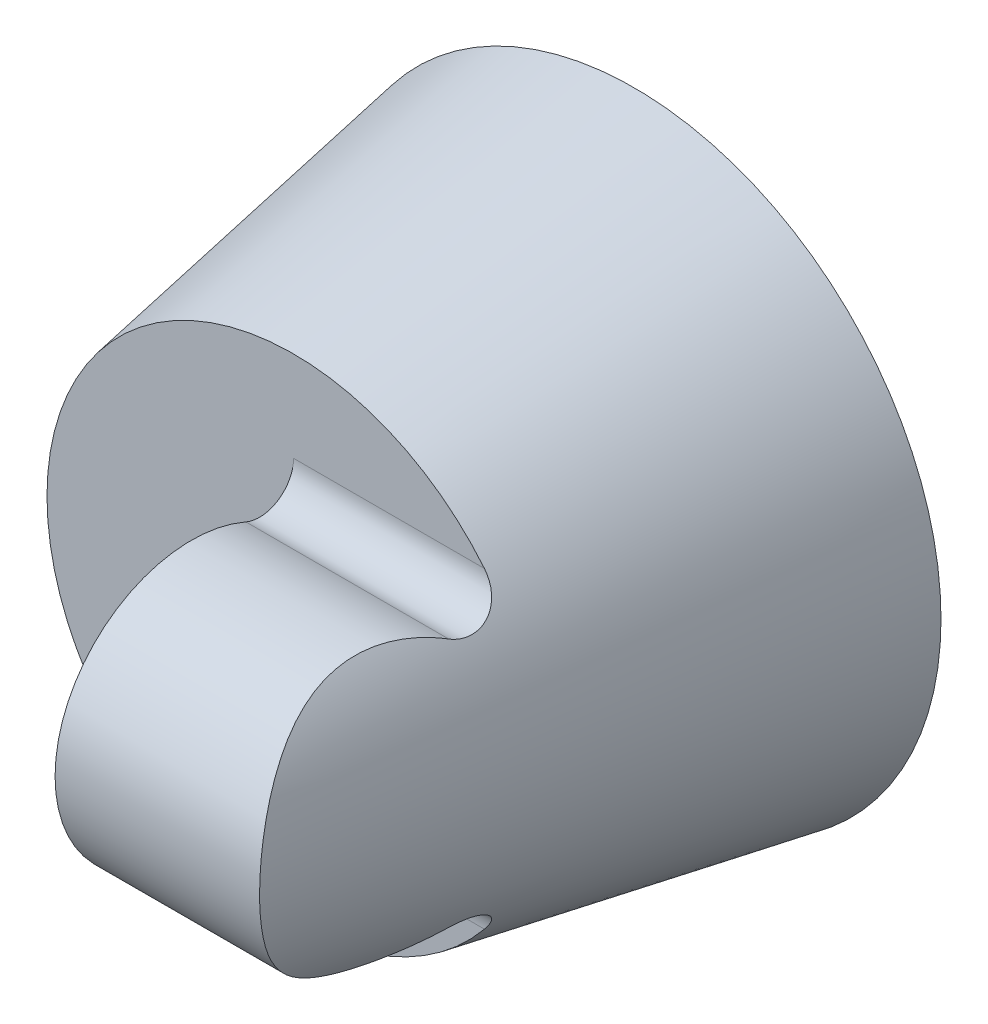
ISO-10303-21;
HEADER;
FILE_DESCRIPTION(('STEP AP214'),'2;1');
FILE_NAME('part.step','',(''),(''),'','','');
FILE_SCHEMA(('AUTOMOTIVE_DESIGN { 1 0 10303 214 1 1 1 1 }'));
ENDSEC;
DATA;
#1=APPLICATION_CONTEXT('core data for automotive mechanical design processes');
#2=APPLICATION_PROTOCOL_DEFINITION('international standard','automotive_design',2000,#1);
#3=PRODUCT_CONTEXT('',#1,'mechanical');
#4=PRODUCT('Part','Part','',(#3));
#5=PRODUCT_RELATED_PRODUCT_CATEGORY('part','',(#4));
#6=PRODUCT_DEFINITION_FORMATION('','',#4);
#7=PRODUCT_DEFINITION_CONTEXT('part definition',#1,'design');
#8=PRODUCT_DEFINITION('design','',#6,#7);
#9=PRODUCT_DEFINITION_SHAPE('','',#8);
#10=(LENGTH_UNIT() NAMED_UNIT(*) SI_UNIT(.MILLI.,.METRE.));
#11=(NAMED_UNIT(*) PLANE_ANGLE_UNIT() SI_UNIT($,.RADIAN.));
#12=(NAMED_UNIT(*) SI_UNIT($,.STERADIAN.) SOLID_ANGLE_UNIT());
#13=UNCERTAINTY_MEASURE_WITH_UNIT(LENGTH_MEASURE(1.E-05),#10,'distance_accuracy_value','');
#14=(GEOMETRIC_REPRESENTATION_CONTEXT(3) GLOBAL_UNCERTAINTY_ASSIGNED_CONTEXT((#13)) GLOBAL_UNIT_ASSIGNED_CONTEXT((#10,
#11,#12)) REPRESENTATION_CONTEXT('',''));
#15=CARTESIAN_POINT('',(0.,0.,0.));
#16=DIRECTION('',(0.,0.,1.));
#17=DIRECTION('',(1.,0.,0.));
#18=AXIS2_PLACEMENT_3D('',#15,#16,#17);
#19=CARTESIAN_POINT('',(0.,0.,50.));
#20=DIRECTION('',(0.,0.,1.));
#21=DIRECTION('',(1.,0.,0.));
#22=AXIS2_PLACEMENT_3D('',#19,#20,#21);
#23=PLANE('',#22);
#24=CARTESIAN_POINT('',(0.,0.,50.));
#25=DIRECTION('',(0.,0.,1.));
#26=DIRECTION('',(1.,0.,0.));
#27=AXIS2_PLACEMENT_3D('',#24,#25,#26);
#28=CIRCLE('',#27,36.1836509645767);
#29=CARTESIAN_POINT('',(28.0045817166819,22.9128784747792,50.));
#30=VERTEX_POINT('',#29);
#31=CARTESIAN_POINT('',(28.0045817166819,-22.9128784747792,50.));
#32=VERTEX_POINT('',#31);
#33=EDGE_CURVE('E89',#30,#32,#28,.T.);
#34=ORIENTED_EDGE('',*,*,#33,.T.);
#35=DIRECTION('',(-1.,0.,0.));
#36=VECTOR('',#35,1.);
#37=CARTESIAN_POINT('',(0.,-22.9128784747792,50.));
#38=LINE('',#37,#36);
#39=CARTESIAN_POINT('',(0.,-22.9128784747792,50.));
#40=VERTEX_POINT('',#39);
#41=EDGE_CURVE('E92',#32,#40,#38,.T.);
#42=ORIENTED_EDGE('',*,*,#41,.T.);
#43=DIRECTION('',(0.,1.,0.));
#44=VECTOR('',#43,1.);
#45=CARTESIAN_POINT('',(0.,0.,50.));
#46=LINE('',#45,#44);
#47=CARTESIAN_POINT('',(0.,22.9128784747792,50.));
#48=VERTEX_POINT('',#47);
#49=EDGE_CURVE('E91',#40,#48,#46,.T.);
#50=ORIENTED_EDGE('',*,*,#49,.T.);
#51=DIRECTION('',(-1.,0.,0.));
#52=VECTOR('',#51,1.);
#53=CARTESIAN_POINT('',(0.,22.9128784747792,50.));
#54=LINE('',#53,#52);
#55=EDGE_CURVE('E83',#48,#30,#54,.F.);
#56=ORIENTED_EDGE('',*,*,#55,.T.);
#57=EDGE_LOOP('',(#34,#42,#50,#56));
#58=FACE_BOUND('',#57,.T.);
#59=ADVANCED_FACE('F39',(#58),#23,.T.);
#60=CARTESIAN_POINT('',(0.,0.,0.));
#61=DIRECTION('',(0.,0.,-1.));
#62=DIRECTION('',(1.,0.,0.));
#63=AXIS2_PLACEMENT_3D('',#60,#61,#62);
#64=CONICAL_SURFACE('',#63,45.,0.174532925199433);
#65=CARTESIAN_POINT('',(26.735650953985,-16.9932657035637,75.5465122542046));
#66=CARTESIAN_POINT('',(26.8256812033181,-16.6921232034422,76.031728075175));
#67=CARTESIAN_POINT('',(26.9262545679072,-16.3709799959119,76.5027608983805));
#68=CARTESIAN_POINT('',(27.1424616532396,-15.6914401739554,77.4137859536683));
#69=CARTESIAN_POINT('',(27.2581064429691,-15.3330162186833,77.8537550016268));
#70=CARTESIAN_POINT('',(27.4989421870758,-14.5803219232676,78.7017002614123));
#71=CARTESIAN_POINT('',(27.6241627450931,-14.1859396300111,79.1095686410796));
#72=CARTESIAN_POINT('',(27.8782192429912,-13.3647178720242,79.8897636134298));
#73=CARTESIAN_POINT('',(28.0070544846206,-12.9378846489981,80.2620970100964));
#74=CARTESIAN_POINT('',(28.2629350994335,-12.0547739496392,80.9687694120351));
#75=CARTESIAN_POINT('',(28.3899834750714,-11.5985555635531,81.3031811503832));
#76=CARTESIAN_POINT('',(28.6377889535744,-10.6582105954403,81.9328890165752));
#77=CARTESIAN_POINT('',(28.7585458224187,-10.1740829767021,82.2281836900383));
#78=CARTESIAN_POINT('',(28.9892495791107,-9.18110328925213,82.7771982555706));
#79=CARTESIAN_POINT('',(29.0992093387543,-8.67228176843281,83.0309678984861));
#80=CARTESIAN_POINT('',(29.3045384356064,-7.63238173373401,83.4951590257565));
#81=CARTESIAN_POINT('',(29.3999083571291,-7.10130411228362,83.7055822462263));
#82=CARTESIAN_POINT('',(29.5717038703581,-6.02607902246342,84.0789628551392));
#83=CARTESIAN_POINT('',(29.6483172405865,-5.48212644979778,84.2423938542228));
#84=CARTESIAN_POINT('',(29.7811049698399,-4.37989610726095,84.5228033087537));
#85=CARTESIAN_POINT('',(29.8372793233915,-3.82161833355379,84.6397817517619));
#86=CARTESIAN_POINT('',(29.9270879522398,-2.69554846405606,84.8257289758765));
#87=CARTESIAN_POINT('',(29.9607313619724,-2.12776031974745,84.8947172134855));
#88=CARTESIAN_POINT('',(30.0042393357039,-0.987473899973739,84.9837897265954));
#89=CARTESIAN_POINT('',(30.0141060574429,-0.414976056646683,85.0038784397413));
#90=CARTESIAN_POINT('',(30.0099142003844,0.674163067082594,84.9953198208519));
#91=CARTESIAN_POINT('',(29.9980757627778,1.19085523343057,84.9711950280525));
#92=CARTESIAN_POINT('',(29.9550801122633,2.21998990773099,84.8831163501241));
#93=CARTESIAN_POINT('',(29.9239243186543,2.73243272509189,84.8191653911307));
#94=CARTESIAN_POINT('',(29.8432533607499,3.74940153504682,84.6521637561815));
#95=CARTESIAN_POINT('',(29.7937387233523,4.25392775441365,84.5491142023512));
#96=CARTESIAN_POINT('',(29.677847599141,5.2517128983917,84.3050077898015));
#97=CARTESIAN_POINT('',(29.6114706398569,5.74497150687023,84.1639498661075));
#98=CARTESIAN_POINT('',(29.4642033708386,6.71468016067764,83.8460104991172));
#99=CARTESIAN_POINT('',(29.3833894258811,7.19120357998317,83.6693169460731));
#100=CARTESIAN_POINT('',(29.2093477945447,8.12748859567426,83.2811589646249));
#101=CARTESIAN_POINT('',(29.1161202813734,8.58725042582167,83.0696950213651));
#102=CARTESIAN_POINT('',(28.9198633893562,9.4879400932493,82.6134590957196));
#103=CARTESIAN_POINT('',(28.8168306928591,9.92886148209318,82.36867582737));
#104=CARTESIAN_POINT('',(28.6039126545829,10.7897895929157,81.8473656975846));
#105=CARTESIAN_POINT('',(28.4940268879621,11.2097950153449,81.5708368672548));
#106=CARTESIAN_POINT('',(28.2600837611825,12.0655463258518,80.9600823002558));
#107=CARTESIAN_POINT('',(28.1356641933591,12.4990706898876,80.6228773778105));
#108=CARTESIAN_POINT('',(27.8869048794909,13.3369635805642,79.9139746732124));
#109=CARTESIAN_POINT('',(27.7625651388311,13.741330310861,79.5422747691129));
#110=CARTESIAN_POINT('',(27.5186737804238,14.5192615668158,78.7656560414995));
#111=CARTESIAN_POINT('',(27.3991264779333,14.8927986392791,78.3607082379315));
#112=CARTESIAN_POINT('',(27.2274242011127,15.4279380462901,77.730073235214));
#113=CARTESIAN_POINT('',(27.1714584460376,15.6021279506089,77.5159864435346));
#114=CARTESIAN_POINT('',(27.0627125433727,15.9419328312074,77.0801967848897));
#115=CARTESIAN_POINT('',(27.0099335960385,16.1075445733742,76.8584910971238));
#116=CARTESIAN_POINT('',(26.85324291648,16.6042687867543,76.1638262970617));
#117=CARTESIAN_POINT('',(26.7558075433071,16.9205293308785,75.6786122588916));
#118=CARTESIAN_POINT('',(26.5841765267063,17.5112671232136,74.6794670472275));
#119=CARTESIAN_POINT('',(26.5099762729382,17.7857526549098,74.1655415945653));
#120=CARTESIAN_POINT('',(26.4206707627051,18.1635824585249,73.3767059637336));
#121=CARTESIAN_POINT('',(26.394580050458,18.2837941643559,73.1109870106573));
#122=CARTESIAN_POINT('',(26.3503482977095,18.5126771393378,72.5740281191589));
#123=CARTESIAN_POINT('',(26.3322051907174,18.6213514028135,72.3027896351109));
#124=CARTESIAN_POINT('',(26.3044655645209,18.8268248708357,71.755449720507));
#125=CARTESIAN_POINT('',(26.2948680993244,18.9236253887683,71.4793488316649));
#126=CARTESIAN_POINT('',(26.2847036398224,19.1050620029728,70.9230273625542));
#127=CARTESIAN_POINT('',(26.2841368230814,19.1896978600256,70.6428067013893));
#128=CARTESIAN_POINT('',(26.2953343775881,19.4014796923482,69.8815837206693));
#129=CARTESIAN_POINT('',(26.3160095236272,19.516904215495,69.3973599216369));
#130=CARTESIAN_POINT('',(26.3855308282464,19.7110286445504,68.4237195119679));
#131=CARTESIAN_POINT('',(26.4343740708682,19.7897323502691,67.9343034439814));
#132=CARTESIAN_POINT('',(26.559870495643,19.9104050021821,66.9543665402008));
#133=CARTESIAN_POINT('',(26.6365322716807,19.9523625828338,66.463845409611));
#134=CARTESIAN_POINT('',(26.8161399775581,20.0000902592028,65.4859012174067));
#135=CARTESIAN_POINT('',(26.919086306098,20.0058598059638,64.9984782029014));
#136=CARTESIAN_POINT('',(27.1394210581701,19.983308136662,64.0698543238651));
#137=CARTESIAN_POINT('',(27.2549385293707,19.9577377345591,63.6281347560599));
#138=CARTESIAN_POINT('',(27.5038296731332,19.8781518941319,62.7522109056259));
#139=CARTESIAN_POINT('',(27.6372100689934,19.824125722979,62.318009522543));
#140=CARTESIAN_POINT('',(27.9192843360121,19.6888447137225,61.4590356114284));
#141=CARTESIAN_POINT('',(28.0679761095279,19.6075936019783,61.0342618014955));
#142=CARTESIAN_POINT('',(28.3781807041134,19.4190537289664,60.195287918349));
#143=CARTESIAN_POINT('',(28.5396953208874,19.3117613165454,59.7810893368564));
#144=CARTESIAN_POINT('',(28.9018416354351,19.0515874656243,58.8937677071447));
#145=CARTESIAN_POINT('',(29.1044150841776,18.8940346039053,58.4228045588158));
#146=CARTESIAN_POINT('',(29.5200434210934,18.5462323641008,57.4979053535212));
#147=CARTESIAN_POINT('',(29.7330991719549,18.3559802916632,57.043970703429));
#148=CARTESIAN_POINT('',(30.1664135898791,17.943872192745,56.153627390491));
#149=CARTESIAN_POINT('',(30.386679057757,17.7219856229551,55.7172361941403));
#150=CARTESIAN_POINT('',(30.8309665621533,17.2477842279824,54.8633097307249));
#151=CARTESIAN_POINT('',(31.0549888327587,16.9954675005816,54.4457756446807));
#152=CARTESIAN_POINT('',(31.5516530292367,16.4041632185311,53.5434204735242));
#153=CARTESIAN_POINT('',(31.8244663265407,16.0581714807377,53.0632598239276));
#154=CARTESIAN_POINT('',(32.3659318214802,15.3237105126026,52.1339685046008));
#155=CARTESIAN_POINT('',(32.6345832681755,14.9352337161103,51.6848433852952));
#156=CARTESIAN_POINT('',(33.1625641610206,14.1169067131309,50.8201909548061));
#157=CARTESIAN_POINT('',(33.4218970152423,13.6870718483982,50.4046512895609));
#158=CARTESIAN_POINT('',(33.8000332820307,13.0122880860894,49.8088715219728));
#159=CARTESIAN_POINT('',(33.9242618181656,12.7823680827372,49.6148762394559));
#160=CARTESIAN_POINT('',(34.1685279183783,12.3125709835591,49.2363832841526));
#161=CARTESIAN_POINT('',(34.2885644031855,12.0726913578554,49.0518880514986));
#162=CARTESIAN_POINT('',(34.600757362644,11.4229879053733,48.5753998713464));
#163=CARTESIAN_POINT('',(34.7886964999466,11.0046925751146,48.2920816415749));
#164=CARTESIAN_POINT('',(35.1481996749036,10.1428126214658,47.7552597884665));
#165=CARTESIAN_POINT('',(35.3197667916414,9.69923277849572,47.5017505568646));
#166=CARTESIAN_POINT('',(35.6435099086179,8.78853423605438,47.0270996032811));
#167=CARTESIAN_POINT('',(35.7956952302863,8.32142700377951,46.8059423143764));
#168=CARTESIAN_POINT('',(36.0778249559513,7.36571113275836,46.3984914162345));
#169=CARTESIAN_POINT('',(36.2077691271343,6.87710226900676,46.2121981719416));
#170=CARTESIAN_POINT('',(36.4435463344934,5.8774542708283,45.8757812652949));
#171=CARTESIAN_POINT('',(36.5491852453308,5.3662709566149,45.7259482980481));
#172=CARTESIAN_POINT('',(36.7325401946773,4.32879259595654,45.4667618879062));
#173=CARTESIAN_POINT('',(36.8102560090789,3.8024974282622,45.3574087698976));
#174=CARTESIAN_POINT('',(36.9357291277171,2.73963625784916,45.1812115410164));
#175=CARTESIAN_POINT('',(36.983505316152,2.20307694972367,45.1143406344355));
#176=CARTESIAN_POINT('',(37.0478738433194,1.12447152271142,45.0243068898741));
#177=CARTESIAN_POINT('',(37.0644703130706,0.582426140246556,45.0011382617522));
#178=CARTESIAN_POINT('',(37.0659427688835,-0.432537975573821,44.9990832317534));
#179=CARTESIAN_POINT('',(37.0545958713023,-0.905452314087852,45.014923919737));
#180=CARTESIAN_POINT('',(37.0080919132797,-1.84776693349267,45.0799412755125));
#181=CARTESIAN_POINT('',(36.9729372373645,-2.31716756154779,45.1291146047929));
#182=CARTESIAN_POINT('',(36.8795492788069,-3.24903452512463,45.2600611882273));
#183=CARTESIAN_POINT('',(36.8213166202433,-3.71150104780865,45.3418335608328));
#184=CARTESIAN_POINT('',(36.6829330975678,-4.62640392856052,45.5368251967414));
#185=CARTESIAN_POINT('',(36.602781562467,-5.07883997911326,45.6500454227399));
#186=CARTESIAN_POINT('',(36.4232919779219,-5.96489375012254,45.9047210129257));
#187=CARTESIAN_POINT('',(36.3242278553098,-6.39868315463664,46.04577412681));
#188=CARTESIAN_POINT('',(36.1079287982617,-7.25160433332062,46.355427335265));
#189=CARTESIAN_POINT('',(35.9906942697688,-7.67073643469142,46.5240268144299));
#190=CARTESIAN_POINT('',(35.7398942564102,-8.49254993809502,46.8870653902555));
#191=CARTESIAN_POINT('',(35.6063292217354,-8.89523179321158,47.0815037746154));
#192=CARTESIAN_POINT('',(35.3247294701467,-9.68290729957686,47.494595425074));
#193=CARTESIAN_POINT('',(35.1766886278713,-10.0678933607656,47.7132589471622));
#194=CARTESIAN_POINT('',(34.8484937968798,-10.8667100527364,48.2023529162715));
#195=CARTESIAN_POINT('',(34.6666501924565,-11.2779819534376,48.4758302453256));
#196=CARTESIAN_POINT('',(34.2898662792495,-12.0753440226996,49.0492230130697));
#197=CARTESIAN_POINT('',(34.0949241694893,-12.4614307139825,49.3491420891395));
#198=CARTESIAN_POINT('',(33.694567456372,-13.2077811001355,49.9736421809347));
#199=CARTESIAN_POINT('',(33.4891463383905,-13.5680283878768,50.298238601171));
#200=CARTESIAN_POINT('',(33.0706409094319,-14.2617947706632,50.9702291917275));
#201=CARTESIAN_POINT('',(32.8575562044067,-14.5953124884668,51.3176245350875));
#202=CARTESIAN_POINT('',(32.3872452572024,-15.2931603712472,52.0987942464797));
#203=CARTESIAN_POINT('',(32.1290268884917,-15.6520959733868,52.5368023361072));
#204=CARTESIAN_POINT('',(31.610040114176,-16.3310131356683,53.4406929706575));
#205=CARTESIAN_POINT('',(31.349271330474,-16.6509888224852,53.9065797026196));
#206=CARTESIAN_POINT('',(30.8296723548363,-17.2510190537452,54.864810780075));
#207=CARTESIAN_POINT('',(30.5708431667558,-17.5310541189741,55.3571678751961));
#208=CARTESIAN_POINT('',(30.0601440521507,-18.049599937199,56.3666985909875));
#209=CARTESIAN_POINT('',(29.8082732379717,-18.2881160073922,56.8838690230605));
#210=CARTESIAN_POINT('',(29.3421066643986,-18.6994447664686,57.8870853761683));
#211=CARTESIAN_POINT('',(29.1266151917403,-18.8764972734369,58.3708377313074));
#212=CARTESIAN_POINT('',(28.7095596120391,-19.1941152903364,59.3560836402405));
#213=CARTESIAN_POINT('',(28.5079954524051,-19.3346809380517,59.8575771270312));
#214=CARTESIAN_POINT('',(28.1234961315411,-19.5771807470191,60.8759769077611));
#215=CARTESIAN_POINT('',(27.9405341871424,-19.6791710413008,61.3928596164666));
#216=CARTESIAN_POINT('',(27.5975049506256,-19.842621948222,62.4404655130698));
#217=CARTESIAN_POINT('',(27.4374331189922,-19.9040906057741,62.9711859319515));
#218=CARTESIAN_POINT('',(27.1688464046686,-19.9777043655849,63.954678654359));
#219=CARTESIAN_POINT('',(27.0561829244355,-19.9963219858074,64.4058379945243));
#220=CARTESIAN_POINT('',(26.852236842669,-20.0026912189034,65.3131946302353));
#221=CARTESIAN_POINT('',(26.7609520209584,-19.9904460384386,65.7693913974862));
#222=CARTESIAN_POINT('',(26.6016256975954,-19.9342563538748,66.6837981402501));
#223=CARTESIAN_POINT('',(26.5335783158336,-19.8903198778589,67.142007576699));
#224=CARTESIAN_POINT('',(26.4218197141299,-19.7703434705961,68.0572022442818));
#225=CARTESIAN_POINT('',(26.3781080813748,-19.6943040839571,68.5141874960511));
#226=CARTESIAN_POINT('',(26.3151905839466,-19.510061240399,69.42418388568));
#227=CARTESIAN_POINT('',(26.2960283985863,-19.4018008751086,69.8771865197445));
#228=CARTESIAN_POINT('',(26.2816105303897,-19.15377940331,70.7749132450369));
#229=CARTESIAN_POINT('',(26.2863577251986,-19.014014506966,71.2196363333035));
#230=CARTESIAN_POINT('',(26.3181067777807,-18.7042153291937,72.0970876677038));
#231=CARTESIAN_POINT('',(26.34508821038,-18.5342089410426,72.5298265460019));
#232=CARTESIAN_POINT('',(26.4189227644119,-18.1652590125539,73.3808318933244));
#233=CARTESIAN_POINT('',(26.4657679482082,-17.966327051836,73.7991040711696));
#234=CARTESIAN_POINT('',(26.551955574293,-17.6352669958716,74.4373500145669));
#235=CARTESIAN_POINT('',(26.5854299447576,-17.5125800483375,74.6630922534671));
#236=CARTESIAN_POINT('',(26.6571163495846,-17.2590188071258,75.1090071051923));
#237=CARTESIAN_POINT('',(26.6953260845363,-17.128148502321,75.3291823591966));
#238=CARTESIAN_POINT('',(26.735650953985,-16.9932657035637,75.5465122542046));
#239=B_SPLINE_CURVE_WITH_KNOTS('',3,(#65,#66,#67,#68,#69,#70,#71,#72,#73,#74,#75,#76,#77,#78,
#79,#80,#81,#82,#83,#84,#85,#86,#87,#88,#89,#90,#91,#92,#93,#94,#95,#96,#97,#98,#99,#100,#101,
#102,#103,#104,#105,#106,#107,#108,#109,#110,#111,#112,#113,#114,#115,#116,#117,#118,#119,#120,
#121,#122,#123,#124,#125,#126,#127,#128,#129,#130,#131,#132,#133,#134,#135,#136,#137,#138,#139,
#140,#141,#142,#143,#144,#145,#146,#147,#148,#149,#150,#151,#152,#153,#154,#155,#156,#157,#158,
#159,#160,#161,#162,#163,#164,#165,#166,#167,#168,#169,#170,#171,#172,#173,#174,#175,#176,#177,
#178,#179,#180,#181,#182,#183,#184,#185,#186,#187,#188,#189,#190,#191,#192,#193,#194,#195,#196,
#197,#198,#199,#200,#201,#202,#203,#204,#205,#206,#207,#208,#209,#210,#211,#212,#213,#214,#215,
#216,#217,#218,#219,#220,#221,#222,#223,#224,#225,#226,#227,#228,#229,#230,#231,#232,#233,#234,
#235,#236,#237,#238),.UNSPECIFIED.,.T.,.F.,(4,2,2,2,2,2,2,2,2,2,2,2,2,2,2,2,2,2,2,2,2,2,2,2,2,2,
2,2,2,2,2,2,2,2,2,2,2,2,2,2,2,2,2,2,2,2,2,2,2,2,2,2,2,2,2,2,2,2,2,2,2,2,2,2,2,2,2,2,2,2,2,2,2,2,
2,2,2,2,2,2,2,2,2,2,2,2,4),(0.,1.73410110095019,3.46948304069623,5.21046553858245,
6.95111401401312,8.68836537586749,10.4256813109837,12.1609002936534,13.8960497636534,
15.6130438977757,17.3300384916763,19.0463365640634,20.7624788761304,22.3127616348964,
23.8629305036491,25.4130548860857,26.9632227067097,28.505421389309,30.0475985557369,
31.5902993963049,33.1330959685788,34.8206701470118,36.5083482048673,38.1975132462512,
39.0421424818714,39.8870878731997,41.6464309399831,43.4054246942856,44.2835319702476,
45.1614107900796,46.0391924177039,46.9169913046098,48.4093298699367,49.9015139762496,
51.3941594508999,52.8868275682552,54.2573596338175,55.6284090015267,56.9992707861934,
58.3703248854012,59.977875593284,61.5855588238189,63.1948049290269,64.8041516819233,
66.7570079249785,68.7102125196761,70.6626953471104,71.6388318597126,72.6152178595146,
74.2306463333447,75.8457703925231,77.4601147210315,79.0744759469766,80.7013150556335,
82.3281672208228,83.9539922254725,85.5796018084484,86.9977952971131,88.4158467641487,
89.8338598866131,91.2519164226996,92.6508091868836,94.0496707030578,95.4484936648333,
96.8479111138689,98.4253090715888,100.002924358926,101.581532668613,103.160222263906,
105.025447483339,106.89095354387,108.757366331322,110.623539917478,112.297182983599,
113.970819729509,115.642011621937,117.312871626369,118.707601298273,120.102186062985,
121.496417673558,122.890625632718,124.287310790367,125.684164051927,127.07973554223,
128.474749881216,129.251835814526,130.028545876141),.UNSPECIFIED.);
#240=CARTESIAN_POINT('',(29.7566448238066,-18.3303027798234,57.));
#241=VERTEX_POINT('',#240);
#242=CARTESIAN_POINT('',(29.7566448238066,18.3303027798234,57.));
#243=VERTEX_POINT('',#242);
#244=EDGE_CURVE('E101',#241,#243,#239,.T.);
#245=ORIENTED_EDGE('',*,*,#244,.F.);
#246=CARTESIAN_POINT('',(29.7566448238066,-18.3303027798234,57.));
#247=CARTESIAN_POINT('',(29.8104888487889,-18.2809208359623,56.8868827182332));
#248=CARTESIAN_POINT('',(29.8622785251808,-18.2353791278521,56.7710767550839));
#249=CARTESIAN_POINT('',(29.9614474588437,-18.1525675485222,56.5346360602245));
#250=CARTESIAN_POINT('',(30.0088242034469,-18.1153023733411,56.4139986327623));
#251=CARTESIAN_POINT('',(30.0989860261628,-18.0495596848347,56.1680761552474));
#252=CARTESIAN_POINT('',(30.1417517353328,-18.021118364737,56.0427742643272));
#253=CARTESIAN_POINT('',(30.2221154792378,-17.9737970842928,55.7887702732287));
#254=CARTESIAN_POINT('',(30.2597144232903,-17.9549154399307,55.6600687761247));
#255=CARTESIAN_POINT('',(30.3295351630845,-17.9271461196822,55.3996114735109));
#256=CARTESIAN_POINT('',(30.3617359461239,-17.9182967590625,55.2678459066624));
#257=CARTESIAN_POINT('',(30.4202311197934,-17.9111213128145,55.002725789776));
#258=CARTESIAN_POINT('',(30.4465258978065,-17.9127945367865,54.8693713445593));
#259=CARTESIAN_POINT('',(30.4928282483617,-17.9269233938778,54.6024006917945));
#260=CARTESIAN_POINT('',(30.5128478383019,-17.9393582437888,54.4687854838004));
#261=CARTESIAN_POINT('',(30.5463566107048,-17.9751068030205,54.2021950207227));
#262=CARTESIAN_POINT('',(30.5598464325276,-17.9984194468063,54.0692197042473));
#263=CARTESIAN_POINT('',(30.5792716567397,-18.0537141760222,53.8150323082366));
#264=CARTESIAN_POINT('',(30.5856983991033,-18.0849135139199,53.6936869191821));
#265=CARTESIAN_POINT('',(30.5925714320738,-18.1563957500227,53.4535315325582));
#266=CARTESIAN_POINT('',(30.5930181291177,-18.1966780307116,53.3347213632292));
#267=CARTESIAN_POINT('',(30.5878161777129,-18.2860183977607,53.1005598399817));
#268=CARTESIAN_POINT('',(30.5821663878992,-18.3350781259722,52.9852091378898));
#269=CARTESIAN_POINT('',(30.5647166667293,-18.4415152568967,52.7588962742025));
#270=CARTESIAN_POINT('',(30.5529169068796,-18.4988924276258,52.6479339903184));
#271=CARTESIAN_POINT('',(30.5240048266732,-18.618002863338,52.4372134768722));
#272=CARTESIAN_POINT('',(30.5072215330527,-18.6793211337685,52.3371748614948));
#273=CARTESIAN_POINT('',(30.4682444882426,-18.8083132489535,52.1423439944729));
#274=CARTESIAN_POINT('',(30.4460489992363,-18.8759891307916,52.0475534399622));
#275=CARTESIAN_POINT('',(30.3963877075684,-19.0170067468419,51.8638258803463));
#276=CARTESIAN_POINT('',(30.3689244488015,-19.0903457360726,51.7748860775435));
#277=CARTESIAN_POINT('',(30.308885863003,-19.2420651345438,51.6031984484369));
#278=CARTESIAN_POINT('',(30.2763086021892,-19.3204474441957,51.5204529819788));
#279=CARTESIAN_POINT('',(30.2052025313557,-19.483975640835,51.3590918179939));
#280=CARTESIAN_POINT('',(30.1665233641131,-19.5692544688408,51.2806770688774));
#281=CARTESIAN_POINT('',(30.0842490648635,-19.7436479070254,51.1309947018822));
#282=CARTESIAN_POINT('',(30.0406521652726,-19.8327638892338,51.0597296713324));
#283=CARTESIAN_POINT('',(29.9029543536793,-20.1046961660387,50.856914094088));
#284=CARTESIAN_POINT('',(29.8018924386357,-20.2922209760361,50.7362222031336));
#285=CARTESIAN_POINT('',(29.5708645473535,-20.6970210921774,50.5111306708522));
#286=CARTESIAN_POINT('',(29.4388859368052,-20.9151679353769,50.4104186131504));
#287=CARTESIAN_POINT('',(29.1584647306618,-21.3542829169172,50.2433154425948));
#288=CARTESIAN_POINT('',(29.0099995069437,-21.5752545551264,50.1769722265271));
#289=CARTESIAN_POINT('',(28.7214566122659,-21.9847391687684,50.0830449039816));
#290=CARTESIAN_POINT('',(28.5830433465452,-22.1735280542819,50.0513789262586));
#291=CARTESIAN_POINT('',(28.298942393757,-22.5467352441458,50.0099146588383));
#292=CARTESIAN_POINT('',(28.1532892100738,-22.7311690653718,50.0000212316666));
#293=CARTESIAN_POINT('',(28.0045817166819,-22.9128784747792,50.));
#294=B_SPLINE_CURVE_WITH_KNOTS('',3,(#246,#247,#248,#249,#250,#251,#252,#253,#254,#255,#256,
#257,#258,#259,#260,#261,#262,#263,#264,#265,#266,#267,#268,#269,#270,#271,#272,#273,#274,#275,
#276,#277,#278,#279,#280,#281,#282,#283,#284,#285,#286,#287,#288,#289,#290,#291,#292,#293),
.UNSPECIFIED.,.F.,.F.,(4,2,2,2,2,2,2,2,2,2,2,2,2,2,2,2,2,2,2,2,2,2,2,4),(0.,0.403926111418694,
0.808080825082063,1.21387200762694,1.61959168182236,2.02685571360294,2.43409302456744,
2.84054561593557,3.24695840157885,3.62284327878178,3.9987026086347,4.37463231789132,
4.75055154401249,5.10573031169533,5.46102327522427,5.81614509182283,6.17140151724518,
6.53741633050237,6.90356312244705,7.63531796539357,8.454795250459,9.27541151627503,
9.98292094050897,10.6873326369966),.UNSPECIFIED.);
#295=EDGE_CURVE('E85',#241,#32,#294,.T.);
#296=ORIENTED_EDGE('',*,*,#295,.T.);
#297=ORIENTED_EDGE('',*,*,#33,.F.);
#298=CARTESIAN_POINT('',(28.0045817166819,22.9128784747792,50.));
#299=CARTESIAN_POINT('',(28.1388316799026,22.74882742199,50.0000099364054));
#300=CARTESIAN_POINT('',(28.2705950309474,22.5825615199765,50.008078243699));
#301=CARTESIAN_POINT('',(28.5282224235771,22.2465604814777,50.0417097388298));
#302=CARTESIAN_POINT('',(28.654069589291,22.0768171951248,50.067320070185));
#303=CARTESIAN_POINT('',(28.8990973070165,21.7344690465175,50.1376858414881));
#304=CARTESIAN_POINT('',(29.0182220717727,21.5618523221077,50.1825805903543));
#305=CARTESIAN_POINT('',(29.2471532515917,21.217188133865,50.2928449453639));
#306=CARTESIAN_POINT('',(29.3569711696529,21.0451402275447,50.3581887937671));
#307=CARTESIAN_POINT('',(29.5293983159643,20.7634332526253,50.4839485232865));
#308=CARTESIAN_POINT('',(29.5951383869067,20.6528954025533,50.5381681667929));
#309=CARTESIAN_POINT('',(29.7215219137757,20.4339474702105,50.6559989152968));
#310=CARTESIAN_POINT('',(29.7821667999086,20.325536797439,50.7196073709637));
#311=CARTESIAN_POINT('',(29.8977249006962,20.1120658869896,50.8561541627273));
#312=CARTESIAN_POINT('',(29.9526534131635,20.0069972583573,50.929066370758));
#313=CARTESIAN_POINT('',(30.05647268016,19.8009770430731,51.0843015476604));
#314=CARTESIAN_POINT('',(30.1053662987498,19.7000235188151,51.1666200164774));
#315=CARTESIAN_POINT('',(30.1970956489745,19.502430004395,51.3412605929221));
#316=CARTESIAN_POINT('',(30.2398754988197,19.4058347243259,51.4336628523513));
#317=CARTESIAN_POINT('',(30.318448194572,19.2191019280895,51.627447679231));
#318=CARTESIAN_POINT('',(30.3542442944047,19.1289614169154,51.7288260323022));
#319=CARTESIAN_POINT('',(30.4185609948401,18.9561920063017,51.9400558158459));
#320=CARTESIAN_POINT('',(30.4470776341815,18.8735672123604,52.0499118174348));
#321=CARTESIAN_POINT('',(30.4965682078084,18.716980384643,52.2772293863987));
#322=CARTESIAN_POINT('',(30.5175430817342,18.6430172724691,52.3946900041492));
#323=CARTESIAN_POINT('',(30.5498575798432,18.5126439588365,52.6223698632737));
#324=CARTESIAN_POINT('',(30.562025463149,18.4551936228632,52.7318782681023));
#325=CARTESIAN_POINT('',(30.5803283498031,18.3484085630056,52.955266132585));
#326=CARTESIAN_POINT('',(30.5864637523534,18.2990733022825,53.0691453024835));
#327=CARTESIAN_POINT('',(30.5927461531017,18.2089891489277,53.3003493281171));
#328=CARTESIAN_POINT('',(30.5928958415655,18.1682364070949,53.4176726121746));
#329=CARTESIAN_POINT('',(30.587319827739,18.0956089371051,53.6548973798963));
#330=CARTESIAN_POINT('',(30.5815941730908,18.0637341369614,53.7747988426469));
#331=CARTESIAN_POINT('',(30.5648256556402,18.0103216000693,54.0106230012486));
#332=CARTESIAN_POINT('',(30.5540425179342,17.9883719919145,54.1264713367831));
#333=CARTESIAN_POINT('',(30.5274480995124,17.9527558904504,54.3588972867592));
#334=CARTESIAN_POINT('',(30.511635168677,17.9390921197499,54.4754751282073));
#335=CARTESIAN_POINT('',(30.4751802827488,17.9200116375141,54.7085443909245));
#336=CARTESIAN_POINT('',(30.4545386043212,17.9145944536203,54.8250358167612));
#337=CARTESIAN_POINT('',(30.4086441882037,17.9118557428703,55.057216687038));
#338=CARTESIAN_POINT('',(30.3833898169504,17.9145370893137,55.1729058322403));
#339=CARTESIAN_POINT('',(30.2986409783951,17.9350176640909,55.527761794855));
#340=CARTESIAN_POINT('',(30.2317537002613,17.9660757106008,55.7645384731289));
#341=CARTESIAN_POINT('',(30.0810511480684,18.059758083812,56.2258147879639));
#342=CARTESIAN_POINT('',(29.9972493696035,18.1223573039258,56.4503240320246));
#343=CARTESIAN_POINT('',(29.8821751371208,18.2188599222584,56.7233200356988));
#344=CARTESIAN_POINT('',(29.8577321477781,18.2398877560139,56.7795342456314));
#345=CARTESIAN_POINT('',(29.807900256889,18.2837507684377,56.8906963797575));
#346=CARTESIAN_POINT('',(29.7825130495448,18.3065827855332,56.9456463103659));
#347=CARTESIAN_POINT('',(29.7566448238067,18.3303027798233,57.0000000000001));
#348=B_SPLINE_CURVE_WITH_KNOTS('',3,(#298,#299,#300,#301,#302,#303,#304,#305,#306,#307,#308,
#309,#310,#311,#312,#313,#314,#315,#316,#317,#318,#319,#320,#321,#322,#323,#324,#325,#326,#327,
#328,#329,#330,#331,#332,#333,#334,#335,#336,#337,#338,#339,#340,#341,#342,#343,#344,#345,#346,
#347),.UNSPECIFIED.,.F.,.F.,(4,2,2,2,2,2,2,2,2,2,2,2,2,2,2,2,2,2,2,2,2,2,2,2,4),(0.,
0.635975416947583,1.27366673423825,1.91604426401782,2.5576158881902,2.97595589043587,
3.3941780705709,3.811250577999,4.22812438239486,4.64859343871735,5.06886611635397,
5.48936700841987,5.9098154914449,6.28212185152511,6.65440357241125,7.02651797023412,
7.39862935067744,7.75343153302449,8.10835023525621,8.46324860723873,8.81827290937313,
9.55897461999544,10.2990876656859,10.4934763754779,10.687531695331),.UNSPECIFIED.);
#349=EDGE_CURVE('E48',#30,#243,#348,.T.);
#350=ORIENTED_EDGE('',*,*,#349,.T.);
#351=EDGE_LOOP('',(#245,#296,#297,#350));
#352=FACE_BOUND('',#351,.T.);
#353=CARTESIAN_POINT('',(0.,0.,0.));
#354=DIRECTION('',(0.,0.,1.));
#355=DIRECTION('',(1.,0.,0.));
#356=AXIS2_PLACEMENT_3D('',#353,#354,#355);
#357=CIRCLE('',#356,45.);
#358=CARTESIAN_POINT('',(45.,0.,0.));
#359=VERTEX_POINT('',#358);
#360=EDGE_CURVE('E97',#359,#359,#357,.T.);
#361=ORIENTED_EDGE('',*,*,#360,.T.);
#362=EDGE_LOOP('',(#361));
#363=FACE_BOUND('',#362,.T.);
#364=ADVANCED_FACE('F94',(#352,#363),#64,.T.);
#365=CARTESIAN_POINT('',(0.,0.,0.));
#366=DIRECTION('',(0.,0.,1.));
#367=DIRECTION('',(1.,0.,0.));
#368=AXIS2_PLACEMENT_3D('',#365,#366,#367);
#369=PLANE('',#368);
#370=ORIENTED_EDGE('',*,*,#360,.F.);
#371=EDGE_LOOP('',(#370));
#372=FACE_BOUND('',#371,.T.);
#373=ADVANCED_FACE('F138',(#372),#369,.F.);
#374=CARTESIAN_POINT('',(0.,0.,65.));
#375=DIRECTION('',(1.,0.,0.));
#376=DIRECTION('',(0.,0.,-1.));
#377=AXIS2_PLACEMENT_3D('',#374,#375,#376);
#378=PLANE('',#377);
#379=ORIENTED_EDGE('',*,*,#49,.F.);
#380=CARTESIAN_POINT('',(0.,-22.9128784747792,55.));
#381=DIRECTION('',(1.,0.,0.));
#382=DIRECTION('',(0.,0.,-1.));
#383=AXIS2_PLACEMENT_3D('',#380,#381,#382);
#384=CIRCLE('',#383,5.);
#385=CARTESIAN_POINT('',(0.,-18.3303027798234,57.));
#386=VERTEX_POINT('',#385);
#387=EDGE_CURVE('E108',#40,#386,#384,.T.);
#388=ORIENTED_EDGE('',*,*,#387,.T.);
#389=CARTESIAN_POINT('',(0.,0.,65.));
#390=DIRECTION('',(1.,0.,0.));
#391=DIRECTION('',(0.,0.,-1.));
#392=AXIS2_PLACEMENT_3D('',#389,#390,#391);
#393=CIRCLE('',#392,20.);
#394=CARTESIAN_POINT('',(0.,18.3303027798234,57.));
#395=VERTEX_POINT('',#394);
#396=EDGE_CURVE('E151',#395,#386,#393,.T.);
#397=ORIENTED_EDGE('',*,*,#396,.F.);
#398=CARTESIAN_POINT('',(0.,22.9128784747792,55.));
#399=DIRECTION('',(1.,0.,0.));
#400=DIRECTION('',(0.,0.,-1.));
#401=AXIS2_PLACEMENT_3D('',#398,#399,#400);
#402=CIRCLE('',#401,5.);
#403=EDGE_CURVE('E11',#395,#48,#402,.T.);
#404=ORIENTED_EDGE('',*,*,#403,.T.);
#405=EDGE_LOOP('',(#379,#388,#397,#404));
#406=FACE_BOUND('',#405,.T.);
#407=ADVANCED_FACE('F130',(#406),#378,.F.);
#408=CARTESIAN_POINT('',(45.001,0.,65.));
#409=DIRECTION('',(-1.,0.,0.));
#410=DIRECTION('',(0.,0.,1.));
#411=AXIS2_PLACEMENT_3D('',#408,#409,#410);
#412=CYLINDRICAL_SURFACE('',#411,20.);
#413=ORIENTED_EDGE('',*,*,#396,.T.);
#414=DIRECTION('',(-1.,0.,0.));
#415=VECTOR('',#414,1.);
#416=CARTESIAN_POINT('',(45.001,-18.3303027798234,57.));
#417=LINE('',#416,#415);
#418=EDGE_CURVE('E61',#386,#241,#417,.F.);
#419=ORIENTED_EDGE('',*,*,#418,.T.);
#420=ORIENTED_EDGE('',*,*,#244,.T.);
#421=DIRECTION('',(-1.,0.,0.));
#422=VECTOR('',#421,1.);
#423=CARTESIAN_POINT('',(45.001,18.3303027798234,57.));
#424=LINE('',#423,#422);
#425=EDGE_CURVE('E84',#243,#395,#424,.T.);
#426=ORIENTED_EDGE('',*,*,#425,.T.);
#427=EDGE_LOOP('',(#413,#419,#420,#426));
#428=FACE_BOUND('',#427,.T.);
#429=ADVANCED_FACE('F124',(#428),#412,.T.);
#430=CARTESIAN_POINT('',(45.001,-22.9128784747792,55.));
#431=DIRECTION('',(-1.,0.,0.));
#432=DIRECTION('',(0.,0.,1.));
#433=AXIS2_PLACEMENT_3D('',#430,#431,#432);
#434=CYLINDRICAL_SURFACE('',#433,5.);
#435=ORIENTED_EDGE('',*,*,#295,.F.);
#436=ORIENTED_EDGE('',*,*,#418,.F.);
#437=ORIENTED_EDGE('',*,*,#387,.F.);
#438=ORIENTED_EDGE('',*,*,#41,.F.);
#439=EDGE_LOOP('',(#435,#436,#437,#438));
#440=FACE_BOUND('',#439,.T.);
#441=ADVANCED_FACE('F121',(#440),#434,.F.);
#442=CARTESIAN_POINT('',(45.001,22.9128784747792,55.));
#443=DIRECTION('',(-1.,0.,0.));
#444=DIRECTION('',(0.,0.,1.));
#445=AXIS2_PLACEMENT_3D('',#442,#443,#444);
#446=CYLINDRICAL_SURFACE('',#445,5.);
#447=ORIENTED_EDGE('',*,*,#403,.F.);
#448=ORIENTED_EDGE('',*,*,#425,.F.);
#449=ORIENTED_EDGE('',*,*,#349,.F.);
#450=ORIENTED_EDGE('',*,*,#55,.F.);
#451=EDGE_LOOP('',(#447,#448,#449,#450));
#452=FACE_BOUND('',#451,.T.);
#453=ADVANCED_FACE('F41',(#452),#446,.F.);
#454=CLOSED_SHELL('',(#59,#364,#373,#407,#429,#441,#453));
#455=MANIFOLD_SOLID_BREP('B2',#454);
#456=ADVANCED_BREP_SHAPE_REPRESENTATION('',(#18,#455),#14);
#457=SHAPE_DEFINITION_REPRESENTATION(#9,#456);
ENDSEC;
END-ISO-10303-21;
